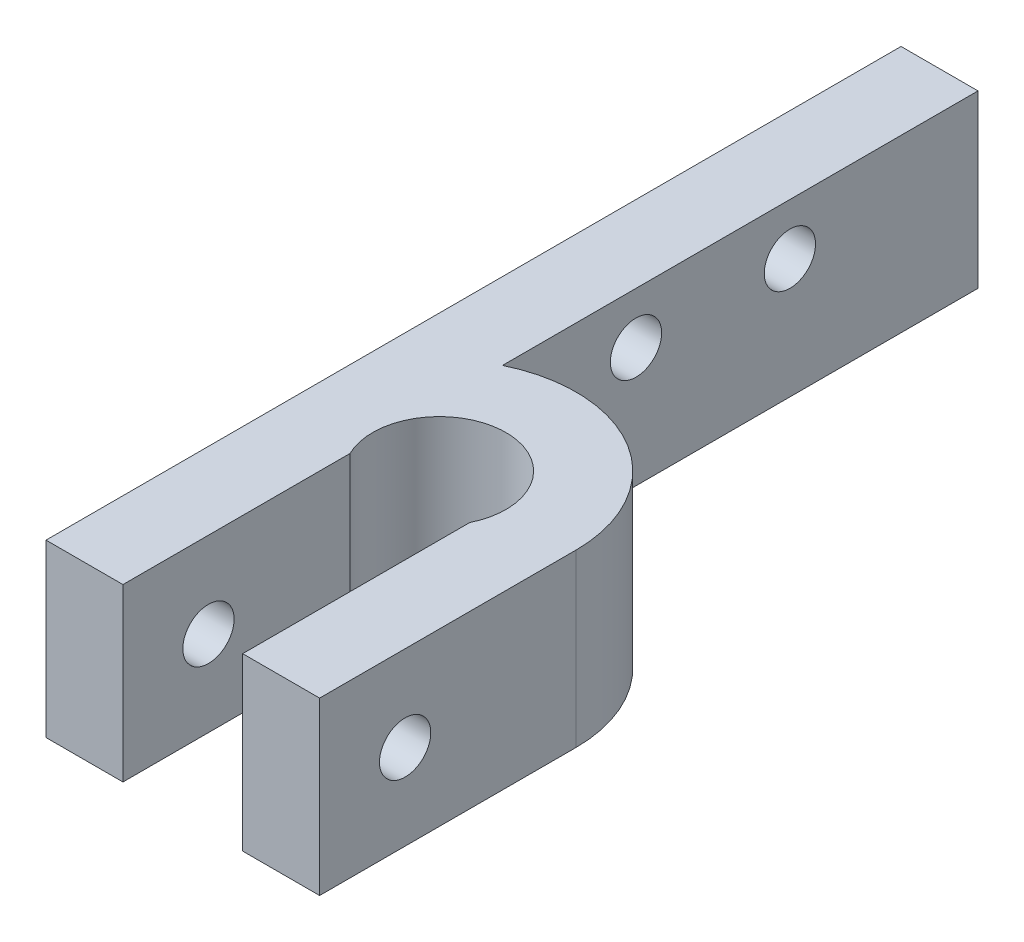
ISO-10303-21;
HEADER;
FILE_DESCRIPTION(('STEP AP214'),'2;1');
FILE_NAME('part.step','',(''),(''),'','','');
FILE_SCHEMA(('AUTOMOTIVE_DESIGN { 1 0 10303 214 1 1 1 1 }'));
ENDSEC;
DATA;
#1=APPLICATION_CONTEXT('core data for automotive mechanical design processes');
#2=APPLICATION_PROTOCOL_DEFINITION('international standard','automotive_design',2000,#1);
#3=PRODUCT_CONTEXT('',#1,'mechanical');
#4=PRODUCT('Part','Part','',(#3));
#5=PRODUCT_RELATED_PRODUCT_CATEGORY('part','',(#4));
#6=PRODUCT_DEFINITION_FORMATION('','',#4);
#7=PRODUCT_DEFINITION_CONTEXT('part definition',#1,'design');
#8=PRODUCT_DEFINITION('design','',#6,#7);
#9=PRODUCT_DEFINITION_SHAPE('','',#8);
#10=(LENGTH_UNIT() NAMED_UNIT(*) SI_UNIT(.MILLI.,.METRE.));
#11=(NAMED_UNIT(*) PLANE_ANGLE_UNIT() SI_UNIT($,.RADIAN.));
#12=(NAMED_UNIT(*) SI_UNIT($,.STERADIAN.) SOLID_ANGLE_UNIT());
#13=UNCERTAINTY_MEASURE_WITH_UNIT(LENGTH_MEASURE(1.E-05),#10,'distance_accuracy_value','');
#14=(GEOMETRIC_REPRESENTATION_CONTEXT(3) GLOBAL_UNCERTAINTY_ASSIGNED_CONTEXT((#13)) GLOBAL_UNIT_ASSIGNED_CONTEXT((#10,
#11,#12)) REPRESENTATION_CONTEXT('',''));
#15=CARTESIAN_POINT('',(0.,0.,0.));
#16=DIRECTION('',(0.,0.,1.));
#17=DIRECTION('',(1.,0.,0.));
#18=AXIS2_PLACEMENT_3D('',#15,#16,#17);
#19=CARTESIAN_POINT('',(-8.,10.,15.));
#20=DIRECTION('',(0.,0.,-1.));
#21=DIRECTION('',(-1.,0.,0.));
#22=AXIS2_PLACEMENT_3D('',#19,#20,#21);
#23=PLANE('',#22);
#24=DIRECTION('',(1.,0.,0.));
#25=VECTOR('',#24,1.);
#26=CARTESIAN_POINT('',(-8.,0.,15.));
#27=LINE('',#26,#25);
#28=CARTESIAN_POINT('',(-8.,0.,15.));
#29=VERTEX_POINT('',#28);
#30=CARTESIAN_POINT('',(-3.5,0.,15.));
#31=VERTEX_POINT('',#30);
#32=EDGE_CURVE('E141',#29,#31,#27,.T.);
#33=ORIENTED_EDGE('',*,*,#32,.T.);
#34=DIRECTION('',(0.,-1.,0.));
#35=VECTOR('',#34,1.);
#36=CARTESIAN_POINT('',(-3.5,10.,15.));
#37=LINE('',#36,#35);
#38=CARTESIAN_POINT('',(-3.5,10.,15.));
#39=VERTEX_POINT('',#38);
#40=EDGE_CURVE('E11',#39,#31,#37,.T.);
#41=ORIENTED_EDGE('',*,*,#40,.F.);
#42=DIRECTION('',(1.,0.,0.));
#43=VECTOR('',#42,1.);
#44=CARTESIAN_POINT('',(-8.,10.,15.));
#45=LINE('',#44,#43);
#46=CARTESIAN_POINT('',(-8.,10.,15.));
#47=VERTEX_POINT('',#46);
#48=EDGE_CURVE('E160',#47,#39,#45,.T.);
#49=ORIENTED_EDGE('',*,*,#48,.F.);
#50=DIRECTION('',(0.,-1.,0.));
#51=VECTOR('',#50,1.);
#52=CARTESIAN_POINT('',(-8.,10.,15.));
#53=LINE('',#52,#51);
#54=EDGE_CURVE('E137',#47,#29,#53,.T.);
#55=ORIENTED_EDGE('',*,*,#54,.T.);
#56=EDGE_LOOP('',(#33,#41,#49,#55));
#57=FACE_BOUND('',#56,.T.);
#58=ADVANCED_FACE('F33',(#57),#23,.F.);
#59=CARTESIAN_POINT('',(-3.5,10.,15.));
#60=DIRECTION('',(-1.,0.,0.));
#61=DIRECTION('',(0.,0.,1.));
#62=AXIS2_PLACEMENT_3D('',#59,#60,#61);
#63=PLANE('',#62);
#64=CARTESIAN_POINT('',(-3.5,5.,10.));
#65=DIRECTION('',(-1.,0.,0.));
#66=DIRECTION('',(0.,0.,1.));
#67=AXIS2_PLACEMENT_3D('',#64,#65,#66);
#68=CIRCLE('',#67,1.5);
#69=CARTESIAN_POINT('',(-3.5,5.,11.5));
#70=VERTEX_POINT('',#69);
#71=EDGE_CURVE('E145',#70,#70,#68,.T.);
#72=ORIENTED_EDGE('',*,*,#71,.T.);
#73=EDGE_LOOP('',(#72));
#74=FACE_BOUND('',#73,.T.);
#75=DIRECTION('',(0.,0.,-1.));
#76=VECTOR('',#75,1.);
#77=CARTESIAN_POINT('',(-3.5,0.,15.));
#78=LINE('',#77,#76);
#79=CARTESIAN_POINT('',(-3.5,0.,1.72046505340853));
#80=VERTEX_POINT('',#79);
#81=EDGE_CURVE('E144',#31,#80,#78,.T.);
#82=ORIENTED_EDGE('',*,*,#81,.T.);
#83=DIRECTION('',(0.,-1.,0.));
#84=VECTOR('',#83,1.);
#85=CARTESIAN_POINT('',(-3.5,10.,1.72046505340853));
#86=LINE('',#85,#84);
#87=CARTESIAN_POINT('',(-3.5,10.,1.72046505340853));
#88=VERTEX_POINT('',#87);
#89=EDGE_CURVE('E41',#88,#80,#86,.T.);
#90=ORIENTED_EDGE('',*,*,#89,.F.);
#91=DIRECTION('',(0.,0.,-1.));
#92=VECTOR('',#91,1.);
#93=CARTESIAN_POINT('',(-3.5,10.,15.));
#94=LINE('',#93,#92);
#95=EDGE_CURVE('E98',#39,#88,#94,.T.);
#96=ORIENTED_EDGE('',*,*,#95,.F.);
#97=ORIENTED_EDGE('',*,*,#40,.T.);
#98=EDGE_LOOP('',(#82,#90,#96,#97));
#99=FACE_BOUND('',#98,.T.);
#100=ADVANCED_FACE('F249',(#74,#99),#63,.F.);
#101=CARTESIAN_POINT('',(0.,10.,0.));
#102=DIRECTION('',(0.,-1.,0.));
#103=DIRECTION('',(0.,0.,-1.));
#104=AXIS2_PLACEMENT_3D('',#101,#102,#103);
#105=CYLINDRICAL_SURFACE('',#104,3.9);
#106=CARTESIAN_POINT('',(0.,0.,0.));
#107=DIRECTION('',(0.,-1.,0.));
#108=DIRECTION('',(0.,0.,-1.));
#109=AXIS2_PLACEMENT_3D('',#106,#107,#108);
#110=CIRCLE('',#109,3.9);
#111=CARTESIAN_POINT('',(3.5,0.,1.72046505340853));
#112=VERTEX_POINT('',#111);
#113=EDGE_CURVE('E147',#80,#112,#110,.T.);
#114=ORIENTED_EDGE('',*,*,#113,.T.);
#115=DIRECTION('',(0.,-1.,0.));
#116=VECTOR('',#115,1.);
#117=CARTESIAN_POINT('',(3.5,10.,1.72046505340853));
#118=LINE('',#117,#116);
#119=CARTESIAN_POINT('',(3.5,10.,1.72046505340853));
#120=VERTEX_POINT('',#119);
#121=EDGE_CURVE('E173',#120,#112,#118,.T.);
#122=ORIENTED_EDGE('',*,*,#121,.F.);
#123=CARTESIAN_POINT('',(0.,10.,0.));
#124=DIRECTION('',(0.,-1.,0.));
#125=DIRECTION('',(0.,0.,-1.));
#126=AXIS2_PLACEMENT_3D('',#123,#124,#125);
#127=CIRCLE('',#126,3.9);
#128=EDGE_CURVE('E181',#88,#120,#127,.T.);
#129=ORIENTED_EDGE('',*,*,#128,.F.);
#130=ORIENTED_EDGE('',*,*,#89,.T.);
#131=EDGE_LOOP('',(#114,#122,#129,#130));
#132=FACE_BOUND('',#131,.T.);
#133=ADVANCED_FACE('F179',(#132),#105,.F.);
#134=CARTESIAN_POINT('',(3.5,10.,1.72046505340853));
#135=DIRECTION('',(1.,0.,0.));
#136=DIRECTION('',(0.,0.,-1.));
#137=AXIS2_PLACEMENT_3D('',#134,#135,#136);
#138=PLANE('',#137);
#139=CARTESIAN_POINT('',(3.5,5.,10.));
#140=DIRECTION('',(1.,0.,0.));
#141=DIRECTION('',(0.,0.,-1.));
#142=AXIS2_PLACEMENT_3D('',#139,#140,#141);
#143=CIRCLE('',#142,1.5);
#144=CARTESIAN_POINT('',(3.5,5.,8.5));
#145=VERTEX_POINT('',#144);
#146=EDGE_CURVE('E209',#145,#145,#143,.T.);
#147=ORIENTED_EDGE('',*,*,#146,.T.);
#148=EDGE_LOOP('',(#147));
#149=FACE_BOUND('',#148,.T.);
#150=DIRECTION('',(0.,0.,1.));
#151=VECTOR('',#150,1.);
#152=CARTESIAN_POINT('',(3.5,0.,1.72046505340853));
#153=LINE('',#152,#151);
#154=CARTESIAN_POINT('',(3.5,0.,15.));
#155=VERTEX_POINT('',#154);
#156=EDGE_CURVE('E149',#112,#155,#153,.T.);
#157=ORIENTED_EDGE('',*,*,#156,.T.);
#158=DIRECTION('',(0.,-1.,0.));
#159=VECTOR('',#158,1.);
#160=CARTESIAN_POINT('',(3.5,10.,15.));
#161=LINE('',#160,#159);
#162=CARTESIAN_POINT('',(3.5,10.,15.));
#163=VERTEX_POINT('',#162);
#164=EDGE_CURVE('E170',#163,#155,#161,.T.);
#165=ORIENTED_EDGE('',*,*,#164,.F.);
#166=DIRECTION('',(0.,0.,1.));
#167=VECTOR('',#166,1.);
#168=CARTESIAN_POINT('',(3.5,10.,1.72046505340853));
#169=LINE('',#168,#167);
#170=EDGE_CURVE('E199',#120,#163,#169,.T.);
#171=ORIENTED_EDGE('',*,*,#170,.F.);
#172=ORIENTED_EDGE('',*,*,#121,.T.);
#173=EDGE_LOOP('',(#157,#165,#171,#172));
#174=FACE_BOUND('',#173,.T.);
#175=ADVANCED_FACE('F190',(#149,#174),#138,.F.);
#176=CARTESIAN_POINT('',(3.5,10.,15.));
#177=DIRECTION('',(0.,0.,-1.));
#178=DIRECTION('',(-1.,0.,0.));
#179=AXIS2_PLACEMENT_3D('',#176,#177,#178);
#180=PLANE('',#179);
#181=DIRECTION('',(1.,0.,0.));
#182=VECTOR('',#181,1.);
#183=CARTESIAN_POINT('',(3.5,0.,15.));
#184=LINE('',#183,#182);
#185=CARTESIAN_POINT('',(8.,0.,15.));
#186=VERTEX_POINT('',#185);
#187=EDGE_CURVE('E151',#155,#186,#184,.T.);
#188=ORIENTED_EDGE('',*,*,#187,.T.);
#189=DIRECTION('',(0.,-1.,0.));
#190=VECTOR('',#189,1.);
#191=CARTESIAN_POINT('',(8.,10.,15.));
#192=LINE('',#191,#190);
#193=CARTESIAN_POINT('',(8.,10.,15.));
#194=VERTEX_POINT('',#193);
#195=EDGE_CURVE('E167',#194,#186,#192,.T.);
#196=ORIENTED_EDGE('',*,*,#195,.F.);
#197=DIRECTION('',(1.,0.,0.));
#198=VECTOR('',#197,1.);
#199=CARTESIAN_POINT('',(3.5,10.,15.));
#200=LINE('',#199,#198);
#201=EDGE_CURVE('E196',#163,#194,#200,.T.);
#202=ORIENTED_EDGE('',*,*,#201,.F.);
#203=ORIENTED_EDGE('',*,*,#164,.T.);
#204=EDGE_LOOP('',(#188,#196,#202,#203));
#205=FACE_BOUND('',#204,.T.);
#206=ADVANCED_FACE('F194',(#205),#180,.F.);
#207=CARTESIAN_POINT('',(8.,10.,15.));
#208=DIRECTION('',(-1.,0.,0.));
#209=DIRECTION('',(0.,0.,1.));
#210=AXIS2_PLACEMENT_3D('',#207,#208,#209);
#211=PLANE('',#210);
#212=CARTESIAN_POINT('',(8.,5.,10.));
#213=DIRECTION('',(-1.,0.,0.));
#214=DIRECTION('',(0.,0.,1.));
#215=AXIS2_PLACEMENT_3D('',#212,#213,#214);
#216=CIRCLE('',#215,1.5);
#217=CARTESIAN_POINT('',(8.,5.,11.5));
#218=VERTEX_POINT('',#217);
#219=EDGE_CURVE('E212',#218,#218,#216,.T.);
#220=ORIENTED_EDGE('',*,*,#219,.T.);
#221=EDGE_LOOP('',(#220));
#222=FACE_BOUND('',#221,.T.);
#223=DIRECTION('',(0.,0.,-1.));
#224=VECTOR('',#223,1.);
#225=CARTESIAN_POINT('',(8.,0.,15.));
#226=LINE('',#225,#224);
#227=CARTESIAN_POINT('',(8.,0.,0.));
#228=VERTEX_POINT('',#227);
#229=EDGE_CURVE('E153',#186,#228,#226,.T.);
#230=ORIENTED_EDGE('',*,*,#229,.T.);
#231=DIRECTION('',(0.,-1.,0.));
#232=VECTOR('',#231,1.);
#233=CARTESIAN_POINT('',(8.,10.,0.));
#234=LINE('',#233,#232);
#235=CARTESIAN_POINT('',(8.,10.,0.));
#236=VERTEX_POINT('',#235);
#237=EDGE_CURVE('E164',#236,#228,#234,.T.);
#238=ORIENTED_EDGE('',*,*,#237,.F.);
#239=DIRECTION('',(0.,0.,-1.));
#240=VECTOR('',#239,1.);
#241=CARTESIAN_POINT('',(8.,10.,15.));
#242=LINE('',#241,#240);
#243=EDGE_CURVE('E198',#194,#236,#242,.T.);
#244=ORIENTED_EDGE('',*,*,#243,.F.);
#245=ORIENTED_EDGE('',*,*,#195,.T.);
#246=EDGE_LOOP('',(#230,#238,#244,#245));
#247=FACE_BOUND('',#246,.T.);
#248=ADVANCED_FACE('F259',(#222,#247),#211,.F.);
#249=CARTESIAN_POINT('',(0.,10.,0.));
#250=DIRECTION('',(0.,-1.,0.));
#251=DIRECTION('',(0.,0.,-1.));
#252=AXIS2_PLACEMENT_3D('',#249,#250,#251);
#253=CYLINDRICAL_SURFACE('',#252,8.);
#254=CARTESIAN_POINT('',(0.,0.,0.));
#255=DIRECTION('',(0.,1.,0.));
#256=DIRECTION('',(0.,0.,-1.));
#257=AXIS2_PLACEMENT_3D('',#254,#255,#256);
#258=CIRCLE('',#257,8.);
#259=CARTESIAN_POINT('',(-3.5,0.,-7.19374728496908));
#260=VERTEX_POINT('',#259);
#261=EDGE_CURVE('E155',#228,#260,#258,.T.);
#262=ORIENTED_EDGE('',*,*,#261,.T.);
#263=DIRECTION('',(0.,-1.,0.));
#264=VECTOR('',#263,1.);
#265=CARTESIAN_POINT('',(-3.5,10.,-7.19374728496908));
#266=LINE('',#265,#264);
#267=CARTESIAN_POINT('',(-3.5,10.,-7.19374728496908));
#268=VERTEX_POINT('',#267);
#269=EDGE_CURVE('E132',#268,#260,#266,.T.);
#270=ORIENTED_EDGE('',*,*,#269,.F.);
#271=CARTESIAN_POINT('',(0.,10.,0.));
#272=DIRECTION('',(0.,1.,0.));
#273=DIRECTION('',(0.,0.,-1.));
#274=AXIS2_PLACEMENT_3D('',#271,#272,#273);
#275=CIRCLE('',#274,8.);
#276=EDGE_CURVE('E123',#236,#268,#275,.T.);
#277=ORIENTED_EDGE('',*,*,#276,.F.);
#278=ORIENTED_EDGE('',*,*,#237,.T.);
#279=EDGE_LOOP('',(#262,#270,#277,#278));
#280=FACE_BOUND('',#279,.T.);
#281=ADVANCED_FACE('F256',(#280),#253,.T.);
#282=CARTESIAN_POINT('',(-3.5,10.,-35.));
#283=DIRECTION('',(-1.,0.,0.));
#284=DIRECTION('',(0.,0.,1.));
#285=AXIS2_PLACEMENT_3D('',#282,#283,#284);
#286=PLANE('',#285);
#287=CARTESIAN_POINT('',(-3.5,7.,-15.));
#288=DIRECTION('',(-1.,0.,0.));
#289=DIRECTION('',(0.,0.,1.));
#290=AXIS2_PLACEMENT_3D('',#287,#288,#289);
#291=CIRCLE('',#290,1.5);
#292=CARTESIAN_POINT('',(-3.5,7.,-13.5));
#293=VERTEX_POINT('',#292);
#294=EDGE_CURVE('E224',#293,#293,#291,.T.);
#295=ORIENTED_EDGE('',*,*,#294,.T.);
#296=EDGE_LOOP('',(#295));
#297=FACE_BOUND('',#296,.T.);
#298=CARTESIAN_POINT('',(-3.5,7.,-24.));
#299=DIRECTION('',(-1.,0.,0.));
#300=DIRECTION('',(0.,0.,1.));
#301=AXIS2_PLACEMENT_3D('',#298,#299,#300);
#302=CIRCLE('',#301,1.5);
#303=CARTESIAN_POINT('',(-3.5,7.,-22.5));
#304=VERTEX_POINT('',#303);
#305=EDGE_CURVE('E216',#304,#304,#302,.T.);
#306=ORIENTED_EDGE('',*,*,#305,.T.);
#307=EDGE_LOOP('',(#306));
#308=FACE_BOUND('',#307,.T.);
#309=DIRECTION('',(0.,0.,-1.));
#310=VECTOR('',#309,1.);
#311=CARTESIAN_POINT('',(-3.5,0.,-35.));
#312=LINE('',#311,#310);
#313=CARTESIAN_POINT('',(-3.5,0.,-35.));
#314=VERTEX_POINT('',#313);
#315=EDGE_CURVE('E131',#260,#314,#312,.T.);
#316=ORIENTED_EDGE('',*,*,#315,.T.);
#317=DIRECTION('',(0.,-1.,0.));
#318=VECTOR('',#317,1.);
#319=CARTESIAN_POINT('',(-3.5,10.,-35.));
#320=LINE('',#319,#318);
#321=CARTESIAN_POINT('',(-3.5,10.,-35.));
#322=VERTEX_POINT('',#321);
#323=EDGE_CURVE('E128',#322,#314,#320,.T.);
#324=ORIENTED_EDGE('',*,*,#323,.F.);
#325=DIRECTION('',(0.,0.,-1.));
#326=VECTOR('',#325,1.);
#327=CARTESIAN_POINT('',(-3.5,10.,-35.));
#328=LINE('',#327,#326);
#329=EDGE_CURVE('E117',#268,#322,#328,.T.);
#330=ORIENTED_EDGE('',*,*,#329,.F.);
#331=ORIENTED_EDGE('',*,*,#269,.T.);
#332=EDGE_LOOP('',(#316,#324,#330,#331));
#333=FACE_BOUND('',#332,.T.);
#334=ADVANCED_FACE('F129',(#297,#308,#333),#286,.F.);
#335=CARTESIAN_POINT('',(-8.,10.,-35.));
#336=DIRECTION('',(0.,0.,1.));
#337=DIRECTION('',(1.,0.,0.));
#338=AXIS2_PLACEMENT_3D('',#335,#336,#337);
#339=PLANE('',#338);
#340=DIRECTION('',(-1.,0.,0.));
#341=VECTOR('',#340,1.);
#342=CARTESIAN_POINT('',(-8.,0.,-35.));
#343=LINE('',#342,#341);
#344=CARTESIAN_POINT('',(-8.,0.,-35.));
#345=VERTEX_POINT('',#344);
#346=EDGE_CURVE('E84',#314,#345,#343,.T.);
#347=ORIENTED_EDGE('',*,*,#346,.T.);
#348=DIRECTION('',(0.,-1.,0.));
#349=VECTOR('',#348,1.);
#350=CARTESIAN_POINT('',(-8.,10.,-35.));
#351=LINE('',#350,#349);
#352=CARTESIAN_POINT('',(-8.,10.,-35.));
#353=VERTEX_POINT('',#352);
#354=EDGE_CURVE('E133',#353,#345,#351,.T.);
#355=ORIENTED_EDGE('',*,*,#354,.F.);
#356=DIRECTION('',(-1.,0.,0.));
#357=VECTOR('',#356,1.);
#358=CARTESIAN_POINT('',(-8.,10.,-35.));
#359=LINE('',#358,#357);
#360=EDGE_CURVE('E121',#322,#353,#359,.T.);
#361=ORIENTED_EDGE('',*,*,#360,.F.);
#362=ORIENTED_EDGE('',*,*,#323,.T.);
#363=EDGE_LOOP('',(#347,#355,#361,#362));
#364=FACE_BOUND('',#363,.T.);
#365=ADVANCED_FACE('F135',(#364),#339,.F.);
#366=CARTESIAN_POINT('',(-8.,10.,15.));
#367=DIRECTION('',(1.,0.,0.));
#368=DIRECTION('',(0.,0.,-1.));
#369=AXIS2_PLACEMENT_3D('',#366,#367,#368);
#370=PLANE('',#369);
#371=CARTESIAN_POINT('',(-8.,7.,-15.));
#372=DIRECTION('',(-1.,0.,0.));
#373=DIRECTION('',(0.,0.,1.));
#374=AXIS2_PLACEMENT_3D('',#371,#372,#373);
#375=CIRCLE('',#374,1.5);
#376=CARTESIAN_POINT('',(-8.,7.,-13.5));
#377=VERTEX_POINT('',#376);
#378=EDGE_CURVE('E227',#377,#377,#375,.T.);
#379=ORIENTED_EDGE('',*,*,#378,.F.);
#380=EDGE_LOOP('',(#379));
#381=FACE_BOUND('',#380,.T.);
#382=CARTESIAN_POINT('',(-8.,7.,-24.));
#383=DIRECTION('',(-1.,0.,0.));
#384=DIRECTION('',(0.,0.,1.));
#385=AXIS2_PLACEMENT_3D('',#382,#383,#384);
#386=CIRCLE('',#385,1.5);
#387=CARTESIAN_POINT('',(-8.,7.,-22.5));
#388=VERTEX_POINT('',#387);
#389=EDGE_CURVE('E221',#388,#388,#386,.T.);
#390=ORIENTED_EDGE('',*,*,#389,.F.);
#391=EDGE_LOOP('',(#390));
#392=FACE_BOUND('',#391,.T.);
#393=CARTESIAN_POINT('',(-8.,5.,10.));
#394=DIRECTION('',(-1.,0.,0.));
#395=DIRECTION('',(0.,0.,1.));
#396=AXIS2_PLACEMENT_3D('',#393,#394,#395);
#397=CIRCLE('',#396,1.5);
#398=CARTESIAN_POINT('',(-8.,5.,11.5));
#399=VERTEX_POINT('',#398);
#400=EDGE_CURVE('E213',#399,#399,#397,.T.);
#401=ORIENTED_EDGE('',*,*,#400,.F.);
#402=EDGE_LOOP('',(#401));
#403=FACE_BOUND('',#402,.T.);
#404=DIRECTION('',(0.,0.,1.));
#405=VECTOR('',#404,1.);
#406=CARTESIAN_POINT('',(-8.,0.,15.));
#407=LINE('',#406,#405);
#408=EDGE_CURVE('E90',#345,#29,#407,.T.);
#409=ORIENTED_EDGE('',*,*,#408,.T.);
#410=ORIENTED_EDGE('',*,*,#54,.F.);
#411=DIRECTION('',(0.,0.,1.));
#412=VECTOR('',#411,1.);
#413=CARTESIAN_POINT('',(-8.,10.,15.));
#414=LINE('',#413,#412);
#415=EDGE_CURVE('E49',#353,#47,#414,.T.);
#416=ORIENTED_EDGE('',*,*,#415,.F.);
#417=ORIENTED_EDGE('',*,*,#354,.T.);
#418=EDGE_LOOP('',(#409,#410,#416,#417));
#419=FACE_BOUND('',#418,.T.);
#420=ADVANCED_FACE('F234',(#381,#392,#403,#419),#370,.F.);
#421=CARTESIAN_POINT('',(0.,10.,0.));
#422=DIRECTION('',(0.,-1.,0.));
#423=DIRECTION('',(0.,0.,-1.));
#424=AXIS2_PLACEMENT_3D('',#421,#422,#423);
#425=PLANE('',#424);
#426=ORIENTED_EDGE('',*,*,#48,.T.);
#427=ORIENTED_EDGE('',*,*,#95,.T.);
#428=ORIENTED_EDGE('',*,*,#128,.T.);
#429=ORIENTED_EDGE('',*,*,#170,.T.);
#430=ORIENTED_EDGE('',*,*,#201,.T.);
#431=ORIENTED_EDGE('',*,*,#243,.T.);
#432=ORIENTED_EDGE('',*,*,#276,.T.);
#433=ORIENTED_EDGE('',*,*,#329,.T.);
#434=ORIENTED_EDGE('',*,*,#360,.T.);
#435=ORIENTED_EDGE('',*,*,#415,.T.);
#436=EDGE_LOOP('',(#426,#427,#428,#429,#430,#431,#432,#433,#434,#435));
#437=FACE_BOUND('',#436,.T.);
#438=ADVANCED_FACE('F119',(#437),#425,.F.);
#439=CARTESIAN_POINT('',(0.,0.,0.));
#440=DIRECTION('',(0.,-1.,0.));
#441=DIRECTION('',(0.,0.,-1.));
#442=AXIS2_PLACEMENT_3D('',#439,#440,#441);
#443=PLANE('',#442);
#444=ORIENTED_EDGE('',*,*,#32,.F.);
#445=ORIENTED_EDGE('',*,*,#408,.F.);
#446=ORIENTED_EDGE('',*,*,#346,.F.);
#447=ORIENTED_EDGE('',*,*,#315,.F.);
#448=ORIENTED_EDGE('',*,*,#261,.F.);
#449=ORIENTED_EDGE('',*,*,#229,.F.);
#450=ORIENTED_EDGE('',*,*,#187,.F.);
#451=ORIENTED_EDGE('',*,*,#156,.F.);
#452=ORIENTED_EDGE('',*,*,#113,.F.);
#453=ORIENTED_EDGE('',*,*,#81,.F.);
#454=EDGE_LOOP('',(#444,#445,#446,#447,#448,#449,#450,#451,#452,#453));
#455=FACE_BOUND('',#454,.T.);
#456=ADVANCED_FACE('F185',(#455),#443,.T.);
#457=CARTESIAN_POINT('',(8.,5.,10.));
#458=DIRECTION('',(-1.,0.,0.));
#459=DIRECTION('',(0.,0.,1.));
#460=AXIS2_PLACEMENT_3D('',#457,#458,#459);
#461=CYLINDRICAL_SURFACE('',#460,1.5);
#462=ORIENTED_EDGE('',*,*,#400,.T.);
#463=EDGE_LOOP('',(#462));
#464=FACE_BOUND('',#463,.T.);
#465=ORIENTED_EDGE('',*,*,#71,.F.);
#466=EDGE_LOOP('',(#465));
#467=FACE_BOUND('',#466,.T.);
#468=ADVANCED_FACE('F242',(#464,#467),#461,.F.);
#469=ORIENTED_EDGE('',*,*,#219,.F.);
#470=EDGE_LOOP('',(#469));
#471=FACE_BOUND('',#470,.T.);
#472=ORIENTED_EDGE('',*,*,#146,.F.);
#473=EDGE_LOOP('',(#472));
#474=FACE_BOUND('',#473,.T.);
#475=ADVANCED_FACE('F245',(#471,#474),#461,.F.);
#476=CARTESIAN_POINT('',(8.,7.,-24.));
#477=DIRECTION('',(-1.,0.,0.));
#478=DIRECTION('',(0.,0.,1.));
#479=AXIS2_PLACEMENT_3D('',#476,#477,#478);
#480=CYLINDRICAL_SURFACE('',#479,1.5);
#481=ORIENTED_EDGE('',*,*,#389,.T.);
#482=EDGE_LOOP('',(#481));
#483=FACE_BOUND('',#482,.T.);
#484=ORIENTED_EDGE('',*,*,#305,.F.);
#485=EDGE_LOOP('',(#484));
#486=FACE_BOUND('',#485,.T.);
#487=ADVANCED_FACE('F339',(#483,#486),#480,.F.);
#488=CARTESIAN_POINT('',(8.,7.,-15.));
#489=DIRECTION('',(-1.,0.,0.));
#490=DIRECTION('',(0.,0.,1.));
#491=AXIS2_PLACEMENT_3D('',#488,#489,#490);
#492=CYLINDRICAL_SURFACE('',#491,1.5);
#493=ORIENTED_EDGE('',*,*,#378,.T.);
#494=EDGE_LOOP('',(#493));
#495=FACE_BOUND('',#494,.T.);
#496=ORIENTED_EDGE('',*,*,#294,.F.);
#497=EDGE_LOOP('',(#496));
#498=FACE_BOUND('',#497,.T.);
#499=ADVANCED_FACE('F231',(#495,#498),#492,.F.);
#500=CLOSED_SHELL('',(#58,#100,#133,#175,#206,#248,#281,#334,#365,#420,#438,#456,#468,#475,#487,#499));
#501=MANIFOLD_SOLID_BREP('B2',#500);
#502=ADVANCED_BREP_SHAPE_REPRESENTATION('',(#18,#501),#14);
#503=SHAPE_DEFINITION_REPRESENTATION(#9,#502);
ENDSEC;
END-ISO-10303-21;
